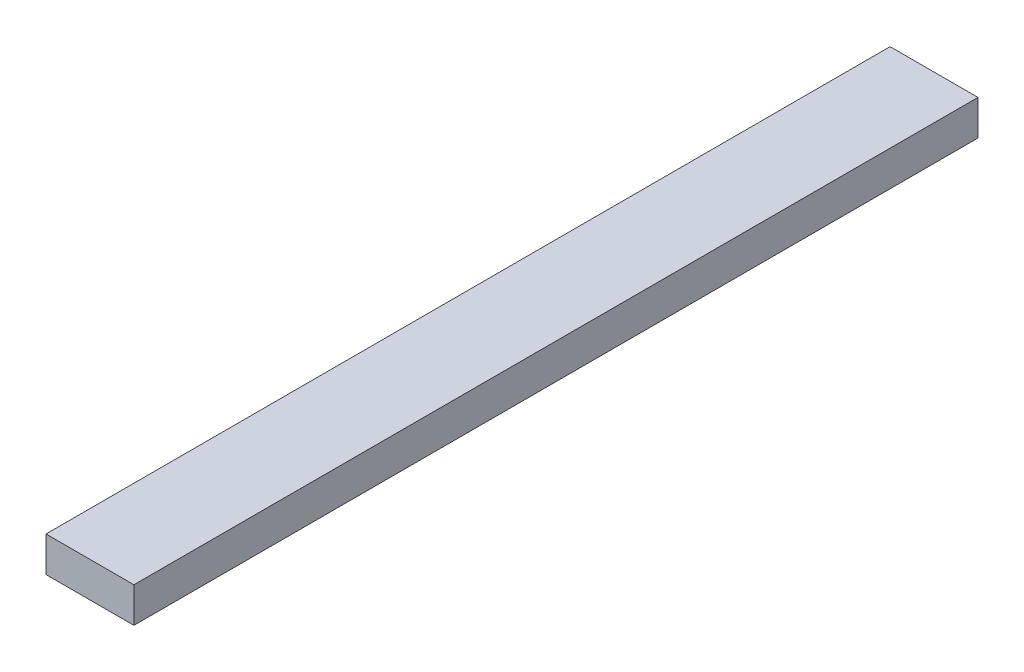
ISO-10303-21;
HEADER;
FILE_DESCRIPTION(('STEP AP214'),'2;1');
FILE_NAME('part.step','',(''),(''),'','','');
FILE_SCHEMA(('AUTOMOTIVE_DESIGN { 1 0 10303 214 1 1 1 1 }'));
ENDSEC;
DATA;
#1=APPLICATION_CONTEXT('core data for automotive mechanical design processes');
#2=APPLICATION_PROTOCOL_DEFINITION('international standard','automotive_design',2000,#1);
#3=PRODUCT_CONTEXT('',#1,'mechanical');
#4=PRODUCT('Part','Part','',(#3));
#5=PRODUCT_RELATED_PRODUCT_CATEGORY('part','',(#4));
#6=PRODUCT_DEFINITION_FORMATION('','',#4);
#7=PRODUCT_DEFINITION_CONTEXT('part definition',#1,'design');
#8=PRODUCT_DEFINITION('design','',#6,#7);
#9=PRODUCT_DEFINITION_SHAPE('','',#8);
#10=(LENGTH_UNIT() NAMED_UNIT(*) SI_UNIT(.MILLI.,.METRE.));
#11=(NAMED_UNIT(*) PLANE_ANGLE_UNIT() SI_UNIT($,.RADIAN.));
#12=(NAMED_UNIT(*) SI_UNIT($,.STERADIAN.) SOLID_ANGLE_UNIT());
#13=UNCERTAINTY_MEASURE_WITH_UNIT(LENGTH_MEASURE(1.E-05),#10,'distance_accuracy_value','');
#14=(GEOMETRIC_REPRESENTATION_CONTEXT(3) GLOBAL_UNCERTAINTY_ASSIGNED_CONTEXT((#13)) GLOBAL_UNIT_ASSIGNED_CONTEXT((#10,
#11,#12)) REPRESENTATION_CONTEXT('',''));
#15=CARTESIAN_POINT('',(0.,0.,0.));
#16=DIRECTION('',(0.,0.,1.));
#17=DIRECTION('',(1.,0.,0.));
#18=AXIS2_PLACEMENT_3D('',#15,#16,#17);
#19=CARTESIAN_POINT('',(0.,0.,304.8));
#20=DIRECTION('',(1.,0.,0.));
#21=DIRECTION('',(0.,0.,-1.));
#22=AXIS2_PLACEMENT_3D('',#19,#20,#21);
#23=PLANE('',#22);
#24=DIRECTION('',(0.,-1.,0.));
#25=VECTOR('',#24,1.);
#26=CARTESIAN_POINT('',(0.,0.,0.));
#27=LINE('',#26,#25);
#28=CARTESIAN_POINT('',(0.,12.7,0.));
#29=VERTEX_POINT('',#28);
#30=CARTESIAN_POINT('',(0.,0.,0.));
#31=VERTEX_POINT('',#30);
#32=EDGE_CURVE('E93',#29,#31,#27,.T.);
#33=ORIENTED_EDGE('',*,*,#32,.T.);
#34=DIRECTION('',(0.,0.,-1.));
#35=VECTOR('',#34,1.);
#36=CARTESIAN_POINT('',(0.,0.,304.8));
#37=LINE('',#36,#35);
#38=CARTESIAN_POINT('',(0.,0.,304.8));
#39=VERTEX_POINT('',#38);
#40=EDGE_CURVE('E11',#39,#31,#37,.T.);
#41=ORIENTED_EDGE('',*,*,#40,.F.);
#42=DIRECTION('',(0.,-1.,0.));
#43=VECTOR('',#42,1.);
#44=CARTESIAN_POINT('',(0.,0.,304.8));
#45=LINE('',#44,#43);
#46=CARTESIAN_POINT('',(0.,12.7,304.8));
#47=VERTEX_POINT('',#46);
#48=EDGE_CURVE('E81',#47,#39,#45,.T.);
#49=ORIENTED_EDGE('',*,*,#48,.F.);
#50=DIRECTION('',(0.,0.,-1.));
#51=VECTOR('',#50,1.);
#52=CARTESIAN_POINT('',(0.,12.7,304.8));
#53=LINE('',#52,#51);
#54=EDGE_CURVE('E89',#47,#29,#53,.T.);
#55=ORIENTED_EDGE('',*,*,#54,.T.);
#56=EDGE_LOOP('',(#33,#41,#49,#55));
#57=FACE_BOUND('',#56,.T.);
#58=ADVANCED_FACE('F30',(#57),#23,.F.);
#59=CARTESIAN_POINT('',(0.,0.,304.8));
#60=DIRECTION('',(0.,1.,0.));
#61=DIRECTION('',(0.,0.,1.));
#62=AXIS2_PLACEMENT_3D('',#59,#60,#61);
#63=PLANE('',#62);
#64=DIRECTION('',(1.,0.,0.));
#65=VECTOR('',#64,1.);
#66=CARTESIAN_POINT('',(0.,0.,0.));
#67=LINE('',#66,#65);
#68=CARTESIAN_POINT('',(31.75,0.,0.));
#69=VERTEX_POINT('',#68);
#70=EDGE_CURVE('E85',#31,#69,#67,.T.);
#71=ORIENTED_EDGE('',*,*,#70,.T.);
#72=DIRECTION('',(0.,0.,-1.));
#73=VECTOR('',#72,1.);
#74=CARTESIAN_POINT('',(31.75,0.,304.8));
#75=LINE('',#74,#73);
#76=CARTESIAN_POINT('',(31.75,0.,304.8));
#77=VERTEX_POINT('',#76);
#78=EDGE_CURVE('E38',#77,#69,#75,.T.);
#79=ORIENTED_EDGE('',*,*,#78,.F.);
#80=DIRECTION('',(1.,0.,0.));
#81=VECTOR('',#80,1.);
#82=CARTESIAN_POINT('',(0.,0.,304.8));
#83=LINE('',#82,#81);
#84=EDGE_CURVE('E76',#39,#77,#83,.T.);
#85=ORIENTED_EDGE('',*,*,#84,.F.);
#86=ORIENTED_EDGE('',*,*,#40,.T.);
#87=EDGE_LOOP('',(#71,#79,#85,#86));
#88=FACE_BOUND('',#87,.T.);
#89=ADVANCED_FACE('F84',(#88),#63,.F.);
#90=CARTESIAN_POINT('',(31.75,0.,304.8));
#91=DIRECTION('',(-1.,0.,0.));
#92=DIRECTION('',(0.,0.,1.));
#93=AXIS2_PLACEMENT_3D('',#90,#91,#92);
#94=PLANE('',#93);
#95=DIRECTION('',(0.,1.,0.));
#96=VECTOR('',#95,1.);
#97=CARTESIAN_POINT('',(31.75,0.,0.));
#98=LINE('',#97,#96);
#99=CARTESIAN_POINT('',(31.75,12.7,0.));
#100=VERTEX_POINT('',#99);
#101=EDGE_CURVE('E63',#69,#100,#98,.T.);
#102=ORIENTED_EDGE('',*,*,#101,.T.);
#103=DIRECTION('',(0.,0.,-1.));
#104=VECTOR('',#103,1.);
#105=CARTESIAN_POINT('',(31.75,12.7,304.8));
#106=LINE('',#105,#104);
#107=CARTESIAN_POINT('',(31.75,12.7,304.8));
#108=VERTEX_POINT('',#107);
#109=EDGE_CURVE('E86',#108,#100,#106,.T.);
#110=ORIENTED_EDGE('',*,*,#109,.F.);
#111=DIRECTION('',(0.,1.,0.));
#112=VECTOR('',#111,1.);
#113=CARTESIAN_POINT('',(31.75,0.,304.8));
#114=LINE('',#113,#112);
#115=EDGE_CURVE('E79',#77,#108,#114,.T.);
#116=ORIENTED_EDGE('',*,*,#115,.F.);
#117=ORIENTED_EDGE('',*,*,#78,.T.);
#118=EDGE_LOOP('',(#102,#110,#116,#117));
#119=FACE_BOUND('',#118,.T.);
#120=ADVANCED_FACE('F87',(#119),#94,.F.);
#121=CARTESIAN_POINT('',(0.,12.7,304.8));
#122=DIRECTION('',(0.,-1.,0.));
#123=DIRECTION('',(0.,0.,-1.));
#124=AXIS2_PLACEMENT_3D('',#121,#122,#123);
#125=PLANE('',#124);
#126=DIRECTION('',(-1.,0.,0.));
#127=VECTOR('',#126,1.);
#128=CARTESIAN_POINT('',(0.,12.7,0.));
#129=LINE('',#128,#127);
#130=EDGE_CURVE('E69',#100,#29,#129,.T.);
#131=ORIENTED_EDGE('',*,*,#130,.T.);
#132=ORIENTED_EDGE('',*,*,#54,.F.);
#133=DIRECTION('',(-1.,0.,0.));
#134=VECTOR('',#133,1.);
#135=CARTESIAN_POINT('',(0.,12.7,304.8));
#136=LINE('',#135,#134);
#137=EDGE_CURVE('E46',#108,#47,#136,.T.);
#138=ORIENTED_EDGE('',*,*,#137,.F.);
#139=ORIENTED_EDGE('',*,*,#109,.T.);
#140=EDGE_LOOP('',(#131,#132,#138,#139));
#141=FACE_BOUND('',#140,.T.);
#142=ADVANCED_FACE('F100',(#141),#125,.F.);
#143=CARTESIAN_POINT('',(0.,0.,304.8));
#144=DIRECTION('',(0.,0.,-1.));
#145=DIRECTION('',(-1.,0.,0.));
#146=AXIS2_PLACEMENT_3D('',#143,#144,#145);
#147=PLANE('',#146);
#148=ORIENTED_EDGE('',*,*,#48,.T.);
#149=ORIENTED_EDGE('',*,*,#84,.T.);
#150=ORIENTED_EDGE('',*,*,#115,.T.);
#151=ORIENTED_EDGE('',*,*,#137,.T.);
#152=EDGE_LOOP('',(#148,#149,#150,#151));
#153=FACE_BOUND('',#152,.T.);
#154=ADVANCED_FACE('F77',(#153),#147,.F.);
#155=CARTESIAN_POINT('',(0.,0.,0.));
#156=DIRECTION('',(0.,0.,-1.));
#157=DIRECTION('',(-1.,0.,0.));
#158=AXIS2_PLACEMENT_3D('',#155,#156,#157);
#159=PLANE('',#158);
#160=ORIENTED_EDGE('',*,*,#32,.F.);
#161=ORIENTED_EDGE('',*,*,#130,.F.);
#162=ORIENTED_EDGE('',*,*,#101,.F.);
#163=ORIENTED_EDGE('',*,*,#70,.F.);
#164=EDGE_LOOP('',(#160,#161,#162,#163));
#165=FACE_BOUND('',#164,.T.);
#166=ADVANCED_FACE('F103',(#165),#159,.T.);
#167=CLOSED_SHELL('',(#58,#89,#120,#142,#154,#166));
#168=MANIFOLD_SOLID_BREP('B2',#167);
#169=ADVANCED_BREP_SHAPE_REPRESENTATION('',(#18,#168),#14);
#170=SHAPE_DEFINITION_REPRESENTATION(#9,#169);
ENDSEC;
END-ISO-10303-21;
